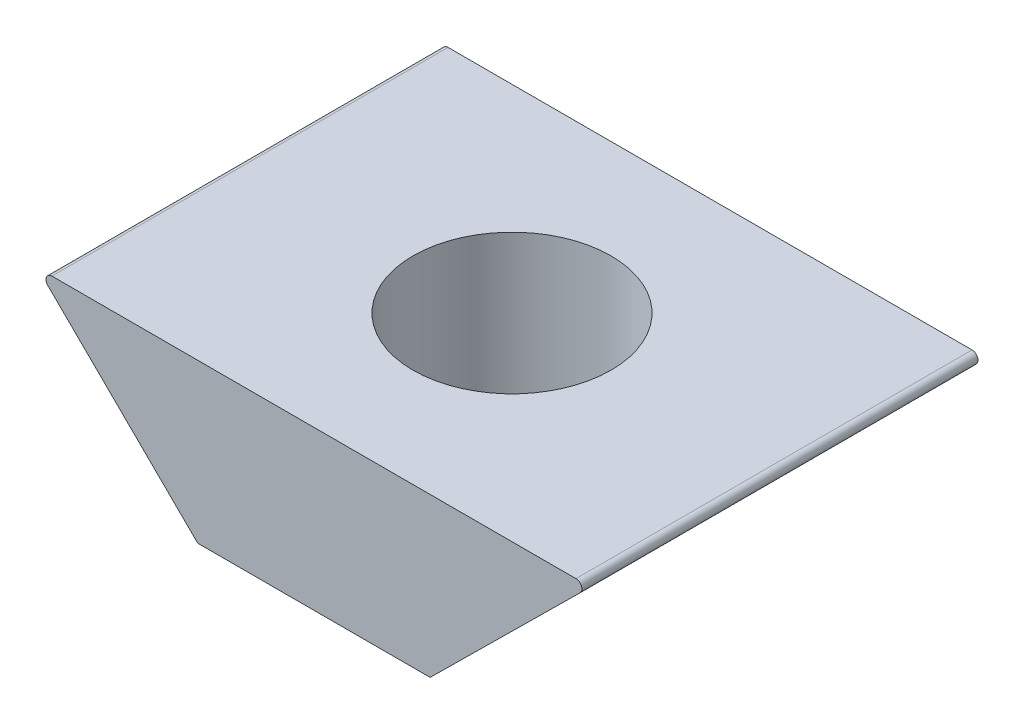
ISO-10303-21;
HEADER;
FILE_DESCRIPTION(('STEP AP214'),'2;1');
FILE_NAME('part.step','',(''),(''),'','','');
FILE_SCHEMA(('AUTOMOTIVE_DESIGN { 1 0 10303 214 1 1 1 1 }'));
ENDSEC;
DATA;
#1=APPLICATION_CONTEXT('core data for automotive mechanical design processes');
#2=APPLICATION_PROTOCOL_DEFINITION('international standard','automotive_design',2000,#1);
#3=PRODUCT_CONTEXT('',#1,'mechanical');
#4=PRODUCT('Part','Part','',(#3));
#5=PRODUCT_RELATED_PRODUCT_CATEGORY('part','',(#4));
#6=PRODUCT_DEFINITION_FORMATION('','',#4);
#7=PRODUCT_DEFINITION_CONTEXT('part definition',#1,'design');
#8=PRODUCT_DEFINITION('design','',#6,#7);
#9=PRODUCT_DEFINITION_SHAPE('','',#8);
#10=(LENGTH_UNIT() NAMED_UNIT(*) SI_UNIT(.MILLI.,.METRE.));
#11=(NAMED_UNIT(*) PLANE_ANGLE_UNIT() SI_UNIT($,.RADIAN.));
#12=(NAMED_UNIT(*) SI_UNIT($,.STERADIAN.) SOLID_ANGLE_UNIT());
#13=UNCERTAINTY_MEASURE_WITH_UNIT(LENGTH_MEASURE(1.E-05),#10,'distance_accuracy_value','');
#14=(GEOMETRIC_REPRESENTATION_CONTEXT(3) GLOBAL_UNCERTAINTY_ASSIGNED_CONTEXT((#13)) GLOBAL_UNIT_ASSIGNED_CONTEXT((#10,
#11,#12)) REPRESENTATION_CONTEXT('',''));
#15=CARTESIAN_POINT('',(0.,0.,0.));
#16=DIRECTION('',(0.,0.,1.));
#17=DIRECTION('',(1.,0.,0.));
#18=AXIS2_PLACEMENT_3D('',#15,#16,#17);
#19=CARTESIAN_POINT('',(-28.0944890227725,4.78818979019299,10.));
#20=DIRECTION('',(0.,0.,-1.));
#21=DIRECTION('',(-1.,0.,0.));
#22=AXIS2_PLACEMENT_3D('',#19,#20,#21);
#23=CYLINDRICAL_SURFACE('',#22,0.150000000000001);
#24=CARTESIAN_POINT('',(-28.0944890227725,4.78818979019299,0.));
#25=DIRECTION('',(0.,0.,1.));
#26=DIRECTION('',(1.,0.,0.));
#27=AXIS2_PLACEMENT_3D('',#24,#25,#26);
#28=CIRCLE('',#27,0.150000000000001);
#29=CARTESIAN_POINT('',(-28.0944890227725,4.93818979019299,0.));
#30=VERTEX_POINT('',#29);
#31=CARTESIAN_POINT('',(-28.1999430181317,4.68151526248006,0.));
#32=VERTEX_POINT('',#31);
#33=EDGE_CURVE('E128',#30,#32,#28,.T.);
#34=ORIENTED_EDGE('',*,*,#33,.T.);
#35=DIRECTION('',(0.,0.,-1.));
#36=VECTOR('',#35,1.);
#37=CARTESIAN_POINT('',(-28.1999430181317,4.68151526248006,10.));
#38=LINE('',#37,#36);
#39=CARTESIAN_POINT('',(-28.1999430181317,4.68151526248006,10.));
#40=VERTEX_POINT('',#39);
#41=EDGE_CURVE('E48',#40,#32,#38,.T.);
#42=ORIENTED_EDGE('',*,*,#41,.F.);
#43=CARTESIAN_POINT('',(-28.0944890227725,4.78818979019299,10.));
#44=DIRECTION('',(0.,0.,1.));
#45=DIRECTION('',(1.,0.,0.));
#46=AXIS2_PLACEMENT_3D('',#43,#44,#45);
#47=CIRCLE('',#46,0.150000000000001);
#48=CARTESIAN_POINT('',(-28.0944890227725,4.93818979019299,10.));
#49=VERTEX_POINT('',#48);
#50=EDGE_CURVE('E162',#49,#40,#47,.T.);
#51=ORIENTED_EDGE('',*,*,#50,.F.);
#52=DIRECTION('',(0.,0.,-1.));
#53=VECTOR('',#52,1.);
#54=CARTESIAN_POINT('',(-28.0944890227725,4.93818979019299,10.));
#55=LINE('',#54,#53);
#56=EDGE_CURVE('E11',#49,#30,#55,.T.);
#57=ORIENTED_EDGE('',*,*,#56,.T.);
#58=EDGE_LOOP('',(#34,#42,#51,#57));
#59=FACE_BOUND('',#58,.T.);
#60=ADVANCED_FACE('F39',(#59),#23,.T.);
#61=CARTESIAN_POINT('',(-24.413292019545,0.938189790192987,10.));
#62=DIRECTION('',(0.703026635728198,0.711163518086165,0.));
#63=DIRECTION('',(-0.711163518086165,0.703026635728198,0.));
#64=AXIS2_PLACEMENT_3D('',#61,#62,#63);
#65=PLANE('',#64);
#66=DIRECTION('',(0.711163518086165,-0.703026635728198,0.));
#67=VECTOR('',#66,1.);
#68=CARTESIAN_POINT('',(-24.413292019545,0.938189790192987,0.));
#69=LINE('',#68,#67);
#70=CARTESIAN_POINT('',(-24.413292019545,0.938189790192987,0.));
#71=VERTEX_POINT('',#70);
#72=EDGE_CURVE('E131',#32,#71,#69,.T.);
#73=ORIENTED_EDGE('',*,*,#72,.T.);
#74=DIRECTION('',(0.,0.,-1.));
#75=VECTOR('',#74,1.);
#76=CARTESIAN_POINT('',(-24.413292019545,0.938189790192987,10.));
#77=LINE('',#76,#75);
#78=CARTESIAN_POINT('',(-24.413292019545,0.938189790192987,10.));
#79=VERTEX_POINT('',#78);
#80=EDGE_CURVE('E115',#79,#71,#77,.T.);
#81=ORIENTED_EDGE('',*,*,#80,.F.);
#82=DIRECTION('',(0.711163518086165,-0.703026635728198,0.));
#83=VECTOR('',#82,1.);
#84=CARTESIAN_POINT('',(-24.413292019545,0.938189790192987,10.));
#85=LINE('',#84,#83);
#86=EDGE_CURVE('E104',#40,#79,#85,.T.);
#87=ORIENTED_EDGE('',*,*,#86,.F.);
#88=ORIENTED_EDGE('',*,*,#41,.T.);
#89=EDGE_LOOP('',(#73,#81,#87,#88));
#90=FACE_BOUND('',#89,.T.);
#91=ADVANCED_FACE('F154',(#90),#65,.F.);
#92=CARTESIAN_POINT('',(-18.5469238391223,0.938189790192987,10.));
#93=DIRECTION('',(0.,1.,0.));
#94=DIRECTION('',(0.,0.,1.));
#95=AXIS2_PLACEMENT_3D('',#92,#93,#94);
#96=PLANE('',#95);
#97=CARTESIAN_POINT('',(-21.4801079293337,0.938189790192986,5.));
#98=DIRECTION('',(0.,1.,0.));
#99=DIRECTION('',(-1.,0.,0.));
#100=AXIS2_PLACEMENT_3D('',#97,#98,#99);
#101=CIRCLE('',#100,2.5);
#102=CARTESIAN_POINT('',(-23.9801079293337,0.938189790192986,5.));
#103=VERTEX_POINT('',#102);
#104=EDGE_CURVE('E132',#103,#103,#101,.T.);
#105=ORIENTED_EDGE('',*,*,#104,.T.);
#106=EDGE_LOOP('',(#105));
#107=FACE_BOUND('',#106,.T.);
#108=DIRECTION('',(1.,0.,0.));
#109=VECTOR('',#108,1.);
#110=CARTESIAN_POINT('',(-18.5469238391223,0.938189790192987,0.));
#111=LINE('',#110,#109);
#112=CARTESIAN_POINT('',(-18.5469238391223,0.938189790192987,0.));
#113=VERTEX_POINT('',#112);
#114=EDGE_CURVE('E113',#71,#113,#111,.T.);
#115=ORIENTED_EDGE('',*,*,#114,.T.);
#116=DIRECTION('',(0.,0.,-1.));
#117=VECTOR('',#116,1.);
#118=CARTESIAN_POINT('',(-18.5469238391223,0.938189790192987,10.));
#119=LINE('',#118,#117);
#120=CARTESIAN_POINT('',(-18.5469238391223,0.938189790192987,10.));
#121=VERTEX_POINT('',#120);
#122=EDGE_CURVE('E110',#121,#113,#119,.T.);
#123=ORIENTED_EDGE('',*,*,#122,.F.);
#124=DIRECTION('',(1.,0.,0.));
#125=VECTOR('',#124,1.);
#126=CARTESIAN_POINT('',(-18.5469238391223,0.938189790192987,10.));
#127=LINE('',#126,#125);
#128=EDGE_CURVE('E98',#79,#121,#127,.T.);
#129=ORIENTED_EDGE('',*,*,#128,.F.);
#130=ORIENTED_EDGE('',*,*,#80,.T.);
#131=EDGE_LOOP('',(#115,#123,#129,#130));
#132=FACE_BOUND('',#131,.T.);
#133=ADVANCED_FACE('F111',(#107,#132),#96,.F.);
#134=CARTESIAN_POINT('',(-14.7602728405356,4.68151526248006,10.));
#135=DIRECTION('',(-0.703026635728199,0.711163518086165,0.));
#136=DIRECTION('',(-0.711163518086165,-0.703026635728199,0.));
#137=AXIS2_PLACEMENT_3D('',#134,#135,#136);
#138=PLANE('',#137);
#139=DIRECTION('',(0.711163518086165,0.703026635728199,0.));
#140=VECTOR('',#139,1.);
#141=CARTESIAN_POINT('',(-14.7602728405356,4.68151526248006,0.));
#142=LINE('',#141,#140);
#143=CARTESIAN_POINT('',(-14.7602728405356,4.68151526248006,0.));
#144=VERTEX_POINT('',#143);
#145=EDGE_CURVE('E80',#113,#144,#142,.T.);
#146=ORIENTED_EDGE('',*,*,#145,.T.);
#147=DIRECTION('',(0.,0.,-1.));
#148=VECTOR('',#147,1.);
#149=CARTESIAN_POINT('',(-14.7602728405356,4.68151526248006,10.));
#150=LINE('',#149,#148);
#151=CARTESIAN_POINT('',(-14.7602728405356,4.68151526248006,10.));
#152=VERTEX_POINT('',#151);
#153=EDGE_CURVE('E116',#152,#144,#150,.T.);
#154=ORIENTED_EDGE('',*,*,#153,.F.);
#155=DIRECTION('',(0.711163518086165,0.703026635728199,0.));
#156=VECTOR('',#155,1.);
#157=CARTESIAN_POINT('',(-14.7602728405356,4.68151526248006,10.));
#158=LINE('',#157,#156);
#159=EDGE_CURVE('E102',#121,#152,#158,.T.);
#160=ORIENTED_EDGE('',*,*,#159,.F.);
#161=ORIENTED_EDGE('',*,*,#122,.T.);
#162=EDGE_LOOP('',(#146,#154,#160,#161));
#163=FACE_BOUND('',#162,.T.);
#164=ADVANCED_FACE('F118',(#163),#138,.F.);
#165=CARTESIAN_POINT('',(-14.8657268358948,4.78818979019299,10.));
#166=DIRECTION('',(0.,0.,-1.));
#167=DIRECTION('',(-1.,0.,0.));
#168=AXIS2_PLACEMENT_3D('',#165,#166,#167);
#169=CYLINDRICAL_SURFACE('',#168,0.15);
#170=CARTESIAN_POINT('',(-14.8657268358948,4.78818979019299,0.));
#171=DIRECTION('',(0.,0.,1.));
#172=DIRECTION('',(1.,0.,0.));
#173=AXIS2_PLACEMENT_3D('',#170,#171,#172);
#174=CIRCLE('',#173,0.15);
#175=CARTESIAN_POINT('',(-14.8657268358948,4.93818979019299,0.));
#176=VERTEX_POINT('',#175);
#177=EDGE_CURVE('E87',#144,#176,#174,.T.);
#178=ORIENTED_EDGE('',*,*,#177,.T.);
#179=DIRECTION('',(0.,0.,-1.));
#180=VECTOR('',#179,1.);
#181=CARTESIAN_POINT('',(-14.8657268358948,4.93818979019299,10.));
#182=LINE('',#181,#180);
#183=CARTESIAN_POINT('',(-14.8657268358948,4.93818979019299,10.));
#184=VERTEX_POINT('',#183);
#185=EDGE_CURVE('E124',#184,#176,#182,.T.);
#186=ORIENTED_EDGE('',*,*,#185,.F.);
#187=CARTESIAN_POINT('',(-14.8657268358948,4.78818979019299,10.));
#188=DIRECTION('',(0.,0.,1.));
#189=DIRECTION('',(1.,0.,0.));
#190=AXIS2_PLACEMENT_3D('',#187,#188,#189);
#191=CIRCLE('',#190,0.15);
#192=EDGE_CURVE('E121',#152,#184,#191,.T.);
#193=ORIENTED_EDGE('',*,*,#192,.F.);
#194=ORIENTED_EDGE('',*,*,#153,.T.);
#195=EDGE_LOOP('',(#178,#186,#193,#194));
#196=FACE_BOUND('',#195,.T.);
#197=ADVANCED_FACE('F185',(#196),#169,.T.);
#198=CARTESIAN_POINT('',(-18.2838116330374,4.93818979019299,10.));
#199=DIRECTION('',(0.,-1.,0.));
#200=DIRECTION('',(1.,0.,0.));
#201=AXIS2_PLACEMENT_3D('',#198,#199,#200);
#202=PLANE('',#201);
#203=CARTESIAN_POINT('',(-21.4801079293337,4.93818979019299,5.));
#204=DIRECTION('',(0.,1.,0.));
#205=DIRECTION('',(-1.,0.,0.));
#206=AXIS2_PLACEMENT_3D('',#203,#204,#205);
#207=CIRCLE('',#206,2.5);
#208=CARTESIAN_POINT('',(-23.9801079293337,4.93818979019299,5.));
#209=VERTEX_POINT('',#208);
#210=EDGE_CURVE('E169',#209,#209,#207,.T.);
#211=ORIENTED_EDGE('',*,*,#210,.F.);
#212=EDGE_LOOP('',(#211));
#213=FACE_BOUND('',#212,.T.);
#214=DIRECTION('',(-1.,0.,0.));
#215=VECTOR('',#214,1.);
#216=CARTESIAN_POINT('',(-18.2838116330374,4.93818979019299,0.));
#217=LINE('',#216,#215);
#218=EDGE_CURVE('E141',#176,#30,#217,.T.);
#219=ORIENTED_EDGE('',*,*,#218,.T.);
#220=ORIENTED_EDGE('',*,*,#56,.F.);
#221=DIRECTION('',(-1.,0.,0.));
#222=VECTOR('',#221,1.);
#223=CARTESIAN_POINT('',(-24.67640422563,4.93818979019299,10.));
#224=LINE('',#223,#222);
#225=EDGE_CURVE('E56',#184,#49,#224,.T.);
#226=ORIENTED_EDGE('',*,*,#225,.F.);
#227=ORIENTED_EDGE('',*,*,#185,.T.);
#228=EDGE_LOOP('',(#219,#220,#226,#227));
#229=FACE_BOUND('',#228,.T.);
#230=ADVANCED_FACE('F161',(#213,#229),#202,.F.);
#231=CARTESIAN_POINT('',(-14.8657268358948,4.78818979019299,10.));
#232=DIRECTION('',(0.,0.,1.));
#233=DIRECTION('',(1.,0.,0.));
#234=AXIS2_PLACEMENT_3D('',#231,#232,#233);
#235=PLANE('',#234);
#236=ORIENTED_EDGE('',*,*,#225,.T.);
#237=ORIENTED_EDGE('',*,*,#50,.T.);
#238=ORIENTED_EDGE('',*,*,#86,.T.);
#239=ORIENTED_EDGE('',*,*,#128,.T.);
#240=ORIENTED_EDGE('',*,*,#159,.T.);
#241=ORIENTED_EDGE('',*,*,#192,.T.);
#242=EDGE_LOOP('',(#236,#237,#238,#239,#240,#241));
#243=FACE_BOUND('',#242,.T.);
#244=ADVANCED_FACE('F100',(#243),#235,.T.);
#245=CARTESIAN_POINT('',(-14.8657268358948,4.78818979019299,0.));
#246=DIRECTION('',(0.,0.,1.));
#247=DIRECTION('',(1.,0.,0.));
#248=AXIS2_PLACEMENT_3D('',#245,#246,#247);
#249=PLANE('',#248);
#250=ORIENTED_EDGE('',*,*,#33,.F.);
#251=ORIENTED_EDGE('',*,*,#218,.F.);
#252=ORIENTED_EDGE('',*,*,#177,.F.);
#253=ORIENTED_EDGE('',*,*,#145,.F.);
#254=ORIENTED_EDGE('',*,*,#114,.F.);
#255=ORIENTED_EDGE('',*,*,#72,.F.);
#256=EDGE_LOOP('',(#250,#251,#252,#253,#254,#255));
#257=FACE_BOUND('',#256,.T.);
#258=ADVANCED_FACE('F159',(#257),#249,.F.);
#259=CARTESIAN_POINT('',(-21.4801079293337,0.938189790192986,5.));
#260=DIRECTION('',(0.,1.,0.));
#261=DIRECTION('',(-1.,0.,0.));
#262=AXIS2_PLACEMENT_3D('',#259,#260,#261);
#263=CYLINDRICAL_SURFACE('',#262,2.5);
#264=ORIENTED_EDGE('',*,*,#104,.F.);
#265=EDGE_LOOP('',(#264));
#266=FACE_BOUND('',#265,.T.);
#267=ORIENTED_EDGE('',*,*,#210,.T.);
#268=EDGE_LOOP('',(#267));
#269=FACE_BOUND('',#268,.T.);
#270=ADVANCED_FACE('F178',(#266,#269),#263,.F.);
#271=CLOSED_SHELL('',(#60,#91,#133,#164,#197,#230,#244,#258,#270));
#272=MANIFOLD_SOLID_BREP('B2',#271);
#273=ADVANCED_BREP_SHAPE_REPRESENTATION('',(#18,#272),#14);
#274=SHAPE_DEFINITION_REPRESENTATION(#9,#273);
ENDSEC;
END-ISO-10303-21;
